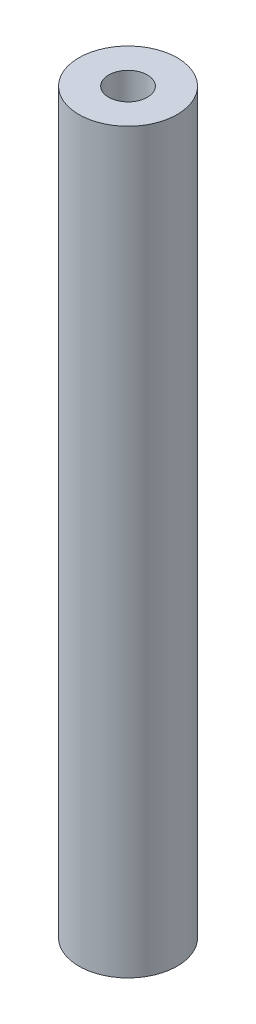
ISO-10303-21;
HEADER;
FILE_DESCRIPTION(('STEP AP214'),'2;1');
FILE_NAME('part.step','',(''),(''),'','','');
FILE_SCHEMA(('AUTOMOTIVE_DESIGN { 1 0 10303 214 1 1 1 1 }'));
ENDSEC;
DATA;
#1=APPLICATION_CONTEXT('core data for automotive mechanical design processes');
#2=APPLICATION_PROTOCOL_DEFINITION('international standard','automotive_design',2000,#1);
#3=PRODUCT_CONTEXT('',#1,'mechanical');
#4=PRODUCT('Part','Part','',(#3));
#5=PRODUCT_RELATED_PRODUCT_CATEGORY('part','',(#4));
#6=PRODUCT_DEFINITION_FORMATION('','',#4);
#7=PRODUCT_DEFINITION_CONTEXT('part definition',#1,'design');
#8=PRODUCT_DEFINITION('design','',#6,#7);
#9=PRODUCT_DEFINITION_SHAPE('','',#8);
#10=(LENGTH_UNIT() NAMED_UNIT(*) SI_UNIT(.MILLI.,.METRE.));
#11=(NAMED_UNIT(*) PLANE_ANGLE_UNIT() SI_UNIT($,.RADIAN.));
#12=(NAMED_UNIT(*) SI_UNIT($,.STERADIAN.) SOLID_ANGLE_UNIT());
#13=UNCERTAINTY_MEASURE_WITH_UNIT(LENGTH_MEASURE(1.E-05),#10,'distance_accuracy_value','');
#14=(GEOMETRIC_REPRESENTATION_CONTEXT(3) GLOBAL_UNCERTAINTY_ASSIGNED_CONTEXT((#13)) GLOBAL_UNIT_ASSIGNED_CONTEXT((#10,
#11,#12)) REPRESENTATION_CONTEXT('',''));
#15=CARTESIAN_POINT('',(0.,0.,0.));
#16=DIRECTION('',(0.,0.,1.));
#17=DIRECTION('',(1.,0.,0.));
#18=AXIS2_PLACEMENT_3D('',#15,#16,#17);
#19=CARTESIAN_POINT('',(0.,38.1,0.));
#20=DIRECTION('',(0.,1.,0.));
#21=DIRECTION('',(0.,0.,1.));
#22=AXIS2_PLACEMENT_3D('',#19,#20,#21);
#23=PLANE('',#22);
#24=CARTESIAN_POINT('',(0.,38.1,0.));
#25=DIRECTION('',(0.,1.,0.));
#26=DIRECTION('',(0.,0.,1.));
#27=AXIS2_PLACEMENT_3D('',#24,#25,#26);
#28=CIRCLE('',#27,2.54);
#29=CARTESIAN_POINT('',(0.,38.1,-2.54));
#30=VERTEX_POINT('',#29);
#31=EDGE_CURVE('E10',#30,#30,#28,.T.);
#32=ORIENTED_EDGE('',*,*,#31,.T.);
#33=EDGE_LOOP('',(#32));
#34=FACE_BOUND('',#33,.T.);
#35=CARTESIAN_POINT('',(0.,38.1,0.));
#36=DIRECTION('',(0.,1.,0.));
#37=DIRECTION('',(0.,0.,1.));
#38=AXIS2_PLACEMENT_3D('',#35,#36,#37);
#39=CIRCLE('',#38,1.00000054);
#40=CARTESIAN_POINT('',(0.,38.1,-1.00000054));
#41=VERTEX_POINT('',#40);
#42=EDGE_CURVE('E42',#41,#41,#39,.T.);
#43=ORIENTED_EDGE('',*,*,#42,.F.);
#44=EDGE_LOOP('',(#43));
#45=FACE_BOUND('',#44,.T.);
#46=ADVANCED_FACE('F31',(#34,#45),#23,.T.);
#47=CARTESIAN_POINT('',(0.,0.,0.));
#48=DIRECTION('',(0.,1.,0.));
#49=DIRECTION('',(0.,0.,1.));
#50=AXIS2_PLACEMENT_3D('',#47,#48,#49);
#51=PLANE('',#50);
#52=CARTESIAN_POINT('',(0.,0.,0.));
#53=DIRECTION('',(0.,1.,0.));
#54=DIRECTION('',(0.,0.,1.));
#55=AXIS2_PLACEMENT_3D('',#52,#53,#54);
#56=CIRCLE('',#55,2.54);
#57=CARTESIAN_POINT('',(0.,0.,-2.54));
#58=VERTEX_POINT('',#57);
#59=EDGE_CURVE('E35',#58,#58,#56,.T.);
#60=ORIENTED_EDGE('',*,*,#59,.F.);
#61=EDGE_LOOP('',(#60));
#62=FACE_BOUND('',#61,.T.);
#63=CARTESIAN_POINT('',(0.,0.,0.));
#64=DIRECTION('',(0.,1.,0.));
#65=DIRECTION('',(0.,0.,1.));
#66=AXIS2_PLACEMENT_3D('',#63,#64,#65);
#67=CIRCLE('',#66,1.00000054);
#68=CARTESIAN_POINT('',(0.,0.,-1.00000054));
#69=VERTEX_POINT('',#68);
#70=EDGE_CURVE('E44',#69,#69,#67,.T.);
#71=ORIENTED_EDGE('',*,*,#70,.T.);
#72=EDGE_LOOP('',(#71));
#73=FACE_BOUND('',#72,.T.);
#74=ADVANCED_FACE('F54',(#62,#73),#51,.F.);
#75=CARTESIAN_POINT('',(0.,38.1,0.));
#76=DIRECTION('',(0.,-1.,0.));
#77=DIRECTION('',(0.,0.,-1.));
#78=AXIS2_PLACEMENT_3D('',#75,#76,#77);
#79=CYLINDRICAL_SURFACE('',#78,2.54);
#80=CARTESIAN_POINT('',(0.,38.1,-2.54));
#81=CARTESIAN_POINT('',(0.,37.703125,-2.54));
#82=CARTESIAN_POINT('',(0.,37.30625,-2.54));
#83=CARTESIAN_POINT('',(0.,36.5125,-2.54));
#84=CARTESIAN_POINT('',(0.,36.115625,-2.54));
#85=CARTESIAN_POINT('',(0.,35.321875,-2.54));
#86=CARTESIAN_POINT('',(0.,34.925,-2.54));
#87=CARTESIAN_POINT('',(0.,34.13125,-2.54));
#88=CARTESIAN_POINT('',(0.,33.734375,-2.54));
#89=CARTESIAN_POINT('',(0.,32.940625,-2.54));
#90=CARTESIAN_POINT('',(0.,32.54375,-2.54));
#91=CARTESIAN_POINT('',(0.,31.75,-2.54));
#92=CARTESIAN_POINT('',(0.,31.353125,-2.54));
#93=CARTESIAN_POINT('',(0.,30.559375,-2.54));
#94=CARTESIAN_POINT('',(0.,30.1625,-2.54));
#95=CARTESIAN_POINT('',(0.,29.36875,-2.54));
#96=CARTESIAN_POINT('',(0.,28.971875,-2.54));
#97=CARTESIAN_POINT('',(0.,28.178125,-2.54));
#98=CARTESIAN_POINT('',(0.,27.78125,-2.54));
#99=CARTESIAN_POINT('',(0.,26.9875,-2.54));
#100=CARTESIAN_POINT('',(0.,26.590625,-2.54));
#101=CARTESIAN_POINT('',(0.,25.796875,-2.54));
#102=CARTESIAN_POINT('',(0.,25.4,-2.54));
#103=CARTESIAN_POINT('',(0.,24.60625,-2.54));
#104=CARTESIAN_POINT('',(0.,24.209375,-2.54));
#105=CARTESIAN_POINT('',(0.,23.415625,-2.54));
#106=CARTESIAN_POINT('',(0.,23.01875,-2.54));
#107=CARTESIAN_POINT('',(0.,22.225,-2.54));
#108=CARTESIAN_POINT('',(0.,21.828125,-2.54));
#109=CARTESIAN_POINT('',(0.,21.034375,-2.54));
#110=CARTESIAN_POINT('',(0.,20.6375,-2.54));
#111=CARTESIAN_POINT('',(0.,19.84375,-2.54));
#112=CARTESIAN_POINT('',(0.,19.446875,-2.54));
#113=CARTESIAN_POINT('',(0.,18.653125,-2.54));
#114=CARTESIAN_POINT('',(0.,18.25625,-2.54));
#115=CARTESIAN_POINT('',(0.,17.4625,-2.54));
#116=CARTESIAN_POINT('',(0.,17.065625,-2.54));
#117=CARTESIAN_POINT('',(0.,16.271875,-2.54));
#118=CARTESIAN_POINT('',(0.,15.875,-2.54));
#119=CARTESIAN_POINT('',(0.,15.08125,-2.54));
#120=CARTESIAN_POINT('',(0.,14.684375,-2.54));
#121=CARTESIAN_POINT('',(0.,13.890625,-2.54));
#122=CARTESIAN_POINT('',(0.,13.49375,-2.54));
#123=CARTESIAN_POINT('',(0.,12.7,-2.54));
#124=CARTESIAN_POINT('',(0.,12.303125,-2.54));
#125=CARTESIAN_POINT('',(0.,11.509375,-2.54));
#126=CARTESIAN_POINT('',(0.,11.1125,-2.54));
#127=CARTESIAN_POINT('',(0.,10.31875,-2.54));
#128=CARTESIAN_POINT('',(0.,9.921875,-2.54));
#129=CARTESIAN_POINT('',(0.,9.128125,-2.54));
#130=CARTESIAN_POINT('',(0.,8.73125,-2.54));
#131=CARTESIAN_POINT('',(0.,7.9375,-2.54));
#132=CARTESIAN_POINT('',(0.,7.540625,-2.54));
#133=CARTESIAN_POINT('',(0.,6.746875,-2.54));
#134=CARTESIAN_POINT('',(0.,6.35,-2.54));
#135=CARTESIAN_POINT('',(0.,5.55625,-2.54));
#136=CARTESIAN_POINT('',(0.,5.159375,-2.54));
#137=CARTESIAN_POINT('',(0.,4.365625,-2.54));
#138=CARTESIAN_POINT('',(0.,3.96875,-2.54));
#139=CARTESIAN_POINT('',(0.,3.175,-2.54));
#140=CARTESIAN_POINT('',(0.,2.778125,-2.54));
#141=CARTESIAN_POINT('',(0.,1.984375,-2.54));
#142=CARTESIAN_POINT('',(0.,1.5875,-2.54));
#143=CARTESIAN_POINT('',(0.,0.79375,-2.54));
#144=CARTESIAN_POINT('',(0.,0.396875,-2.54));
#145=CARTESIAN_POINT('',(0.,0.,-2.54));
#146=B_SPLINE_CURVE_WITH_KNOTS('',3,(#80,#81,#82,#83,#84,#85,#86,#87,#88,#89,#90,#91,#92,#93,
#94,#95,#96,#97,#98,#99,#100,#101,#102,#103,#104,#105,#106,#107,#108,#109,#110,#111,#112,#113,
#114,#115,#116,#117,#118,#119,#120,#121,#122,#123,#124,#125,#126,#127,#128,#129,#130,#131,#132,
#133,#134,#135,#136,#137,#138,#139,#140,#141,#142,#143,#144,#145),.UNSPECIFIED.,.F.,.F.,(4,2,2,
2,2,2,2,2,2,2,2,2,2,2,2,2,2,2,2,2,2,2,2,2,2,2,2,2,2,2,2,2,4),(0.,1.19062499999999,
2.38124999999999,3.571875,4.7625,5.953125,7.14375,8.33437499999999,9.525,10.715625,11.90625,
13.096875,14.2875,15.478125,16.66875,17.859375,19.05,20.240625,21.43125,22.621875,23.8125,
25.003125,26.19375,27.384375,28.575,29.765625,30.95625,32.146875,33.3375,34.528125,35.71875,
36.909375,38.1),.UNSPECIFIED.);
#147=EDGE_CURVE('BSEAM33',#30,#58,#146,.T.);
#148=ORIENTED_EDGE('',*,*,#31,.F.);
#149=ORIENTED_EDGE('',*,*,#59,.T.);
#150=ORIENTED_EDGE('',*,*,#147,.T.);
#151=ORIENTED_EDGE('',*,*,#147,.F.);
#152=EDGE_LOOP('',(#148,#150,#149,#151));
#153=FACE_BOUND('',#152,.T.);
#154=ADVANCED_FACE('F33',(#153),#79,.T.);
#155=CARTESIAN_POINT('',(0.,38.1,0.));
#156=DIRECTION('',(0.,-1.,0.));
#157=DIRECTION('',(0.,0.,-1.));
#158=AXIS2_PLACEMENT_3D('',#155,#156,#157);
#159=CYLINDRICAL_SURFACE('',#158,1.00000054);
#160=CARTESIAN_POINT('',(0.,38.1,-1.00000054));
#161=CARTESIAN_POINT('',(0.,37.703125,-1.00000054));
#162=CARTESIAN_POINT('',(0.,37.30625,-1.00000054));
#163=CARTESIAN_POINT('',(0.,36.5125,-1.00000054));
#164=CARTESIAN_POINT('',(0.,36.115625,-1.00000054));
#165=CARTESIAN_POINT('',(0.,35.321875,-1.00000054));
#166=CARTESIAN_POINT('',(0.,34.925,-1.00000054));
#167=CARTESIAN_POINT('',(0.,34.13125,-1.00000054));
#168=CARTESIAN_POINT('',(0.,33.734375,-1.00000054));
#169=CARTESIAN_POINT('',(0.,32.940625,-1.00000054));
#170=CARTESIAN_POINT('',(0.,32.54375,-1.00000054));
#171=CARTESIAN_POINT('',(0.,31.75,-1.00000054));
#172=CARTESIAN_POINT('',(0.,31.353125,-1.00000054));
#173=CARTESIAN_POINT('',(0.,30.559375,-1.00000054));
#174=CARTESIAN_POINT('',(0.,30.1625,-1.00000054));
#175=CARTESIAN_POINT('',(0.,29.36875,-1.00000054));
#176=CARTESIAN_POINT('',(0.,28.971875,-1.00000054));
#177=CARTESIAN_POINT('',(0.,28.178125,-1.00000054));
#178=CARTESIAN_POINT('',(0.,27.78125,-1.00000054));
#179=CARTESIAN_POINT('',(0.,26.9875,-1.00000054));
#180=CARTESIAN_POINT('',(0.,26.590625,-1.00000054));
#181=CARTESIAN_POINT('',(0.,25.796875,-1.00000054));
#182=CARTESIAN_POINT('',(0.,25.4,-1.00000054));
#183=CARTESIAN_POINT('',(0.,24.60625,-1.00000054));
#184=CARTESIAN_POINT('',(0.,24.209375,-1.00000054));
#185=CARTESIAN_POINT('',(0.,23.415625,-1.00000054));
#186=CARTESIAN_POINT('',(0.,23.01875,-1.00000054));
#187=CARTESIAN_POINT('',(0.,22.225,-1.00000054));
#188=CARTESIAN_POINT('',(0.,21.828125,-1.00000054));
#189=CARTESIAN_POINT('',(0.,21.034375,-1.00000054));
#190=CARTESIAN_POINT('',(0.,20.6375,-1.00000054));
#191=CARTESIAN_POINT('',(0.,19.84375,-1.00000054));
#192=CARTESIAN_POINT('',(0.,19.446875,-1.00000054));
#193=CARTESIAN_POINT('',(0.,18.653125,-1.00000054));
#194=CARTESIAN_POINT('',(0.,18.25625,-1.00000054));
#195=CARTESIAN_POINT('',(0.,17.4625,-1.00000054));
#196=CARTESIAN_POINT('',(0.,17.065625,-1.00000054));
#197=CARTESIAN_POINT('',(0.,16.271875,-1.00000054));
#198=CARTESIAN_POINT('',(0.,15.875,-1.00000054));
#199=CARTESIAN_POINT('',(0.,15.08125,-1.00000054));
#200=CARTESIAN_POINT('',(0.,14.684375,-1.00000054));
#201=CARTESIAN_POINT('',(0.,13.890625,-1.00000054));
#202=CARTESIAN_POINT('',(0.,13.49375,-1.00000054));
#203=CARTESIAN_POINT('',(0.,12.7,-1.00000054));
#204=CARTESIAN_POINT('',(0.,12.303125,-1.00000054));
#205=CARTESIAN_POINT('',(0.,11.509375,-1.00000054));
#206=CARTESIAN_POINT('',(0.,11.1125,-1.00000054));
#207=CARTESIAN_POINT('',(0.,10.31875,-1.00000054));
#208=CARTESIAN_POINT('',(0.,9.92187499999999,-1.00000054));
#209=CARTESIAN_POINT('',(0.,9.128125,-1.00000054));
#210=CARTESIAN_POINT('',(0.,8.73124999999999,-1.00000054));
#211=CARTESIAN_POINT('',(0.,7.93749999999999,-1.00000054));
#212=CARTESIAN_POINT('',(0.,7.54062499999999,-1.00000054));
#213=CARTESIAN_POINT('',(0.,6.746875,-1.00000054));
#214=CARTESIAN_POINT('',(0.,6.35,-1.00000054));
#215=CARTESIAN_POINT('',(0.,5.55625,-1.00000054));
#216=CARTESIAN_POINT('',(0.,5.159375,-1.00000054));
#217=CARTESIAN_POINT('',(0.,4.365625,-1.00000054));
#218=CARTESIAN_POINT('',(0.,3.96875,-1.00000054));
#219=CARTESIAN_POINT('',(0.,3.175,-1.00000054));
#220=CARTESIAN_POINT('',(0.,2.778125,-1.00000054));
#221=CARTESIAN_POINT('',(0.,1.984375,-1.00000054));
#222=CARTESIAN_POINT('',(0.,1.5875,-1.00000054));
#223=CARTESIAN_POINT('',(0.,0.79375,-1.00000054));
#224=CARTESIAN_POINT('',(0.,0.396875,-1.00000054));
#225=CARTESIAN_POINT('',(0.,0.,-1.00000054));
#226=B_SPLINE_CURVE_WITH_KNOTS('',3,(#160,#161,#162,#163,#164,#165,#166,#167,#168,#169,#170,
#171,#172,#173,#174,#175,#176,#177,#178,#179,#180,#181,#182,#183,#184,#185,#186,#187,#188,#189,
#190,#191,#192,#193,#194,#195,#196,#197,#198,#199,#200,#201,#202,#203,#204,#205,#206,#207,#208,
#209,#210,#211,#212,#213,#214,#215,#216,#217,#218,#219,#220,#221,#222,#223,#224,#225),
.UNSPECIFIED.,.F.,.F.,(4,2,2,2,2,2,2,2,2,2,2,2,2,2,2,2,2,2,2,2,2,2,2,2,2,2,2,2,2,2,2,2,4),(0.,
1.190625,2.38125,3.571875,4.7625,5.953125,7.14375,8.334375,9.52500000000001,10.715625,11.90625,
13.096875,14.2875,15.478125,16.66875,17.859375,19.05,20.240625,21.43125,22.621875,23.8125,
25.003125,26.19375,27.384375,28.575,29.765625,30.95625,32.146875,33.3375,34.528125,35.71875,
36.909375,38.1),.UNSPECIFIED.);
#227=EDGE_CURVE('BSEAM50',#41,#69,#226,.T.);
#228=ORIENTED_EDGE('',*,*,#42,.T.);
#229=ORIENTED_EDGE('',*,*,#70,.F.);
#230=ORIENTED_EDGE('',*,*,#227,.T.);
#231=ORIENTED_EDGE('',*,*,#227,.F.);
#232=EDGE_LOOP('',(#228,#230,#229,#231));
#233=FACE_BOUND('',#232,.T.);
#234=ADVANCED_FACE('F50',(#233),#159,.F.);
#235=CLOSED_SHELL('',(#46,#74,#154,#234));
#236=MANIFOLD_SOLID_BREP('B2',#235);
#237=ADVANCED_BREP_SHAPE_REPRESENTATION('',(#18,#236),#14);
#238=SHAPE_DEFINITION_REPRESENTATION(#9,#237);
ENDSEC;
END-ISO-10303-21;
